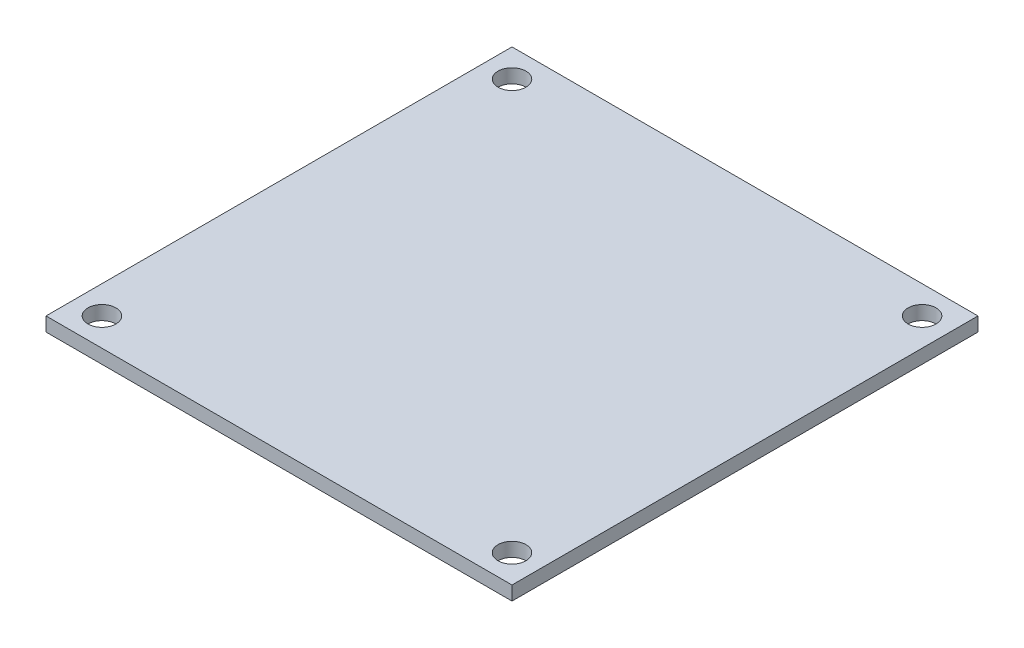
ISO-10303-21;
HEADER;
FILE_DESCRIPTION(('STEP AP214'),'2;1');
FILE_NAME('part.step','',(''),(''),'','','');
FILE_SCHEMA(('AUTOMOTIVE_DESIGN { 1 0 10303 214 1 1 1 1 }'));
ENDSEC;
DATA;
#1=APPLICATION_CONTEXT('core data for automotive mechanical design processes');
#2=APPLICATION_PROTOCOL_DEFINITION('international standard','automotive_design',2000,#1);
#3=PRODUCT_CONTEXT('',#1,'mechanical');
#4=PRODUCT('Part','Part','',(#3));
#5=PRODUCT_RELATED_PRODUCT_CATEGORY('part','',(#4));
#6=PRODUCT_DEFINITION_FORMATION('','',#4);
#7=PRODUCT_DEFINITION_CONTEXT('part definition',#1,'design');
#8=PRODUCT_DEFINITION('design','',#6,#7);
#9=PRODUCT_DEFINITION_SHAPE('','',#8);
#10=(LENGTH_UNIT() NAMED_UNIT(*) SI_UNIT(.MILLI.,.METRE.));
#11=(NAMED_UNIT(*) PLANE_ANGLE_UNIT() SI_UNIT($,.RADIAN.));
#12=(NAMED_UNIT(*) SI_UNIT($,.STERADIAN.) SOLID_ANGLE_UNIT());
#13=UNCERTAINTY_MEASURE_WITH_UNIT(LENGTH_MEASURE(1.E-05),#10,'distance_accuracy_value','');
#14=(GEOMETRIC_REPRESENTATION_CONTEXT(3) GLOBAL_UNCERTAINTY_ASSIGNED_CONTEXT((#13)) GLOBAL_UNIT_ASSIGNED_CONTEXT((#10,
#11,#12)) REPRESENTATION_CONTEXT('',''));
#15=CARTESIAN_POINT('',(0.,0.,0.));
#16=DIRECTION('',(0.,0.,1.));
#17=DIRECTION('',(1.,0.,0.));
#18=AXIS2_PLACEMENT_3D('',#15,#16,#17);
#19=CARTESIAN_POINT('',(0.,1.5,0.));
#20=DIRECTION('',(0.,-1.,0.));
#21=DIRECTION('',(0.,0.,-1.));
#22=AXIS2_PLACEMENT_3D('',#19,#20,#21);
#23=PLANE('',#22);
#24=DIRECTION('',(0.,0.,-1.));
#25=VECTOR('',#24,1.);
#26=CARTESIAN_POINT('',(25.,1.5,25.));
#27=LINE('',#26,#25);
#28=CARTESIAN_POINT('',(25.,1.5,25.));
#29=VERTEX_POINT('',#28);
#30=CARTESIAN_POINT('',(25.,1.5,-25.));
#31=VERTEX_POINT('',#30);
#32=EDGE_CURVE('E89',#29,#31,#27,.T.);
#33=ORIENTED_EDGE('',*,*,#32,.T.);
#34=DIRECTION('',(-1.,0.,0.));
#35=VECTOR('',#34,1.);
#36=CARTESIAN_POINT('',(-25.,1.5,-25.));
#37=LINE('',#36,#35);
#38=CARTESIAN_POINT('',(-25.,1.5,-25.));
#39=VERTEX_POINT('',#38);
#40=EDGE_CURVE('E84',#31,#39,#37,.T.);
#41=ORIENTED_EDGE('',*,*,#40,.T.);
#42=DIRECTION('',(0.,0.,1.));
#43=VECTOR('',#42,1.);
#44=CARTESIAN_POINT('',(-25.,1.5,25.));
#45=LINE('',#44,#43);
#46=CARTESIAN_POINT('',(-25.,1.5,25.));
#47=VERTEX_POINT('',#46);
#48=EDGE_CURVE('E87',#39,#47,#45,.T.);
#49=ORIENTED_EDGE('',*,*,#48,.T.);
#50=DIRECTION('',(1.,0.,0.));
#51=VECTOR('',#50,1.);
#52=CARTESIAN_POINT('',(-25.,1.5,25.));
#53=LINE('',#52,#51);
#54=EDGE_CURVE('E54',#47,#29,#53,.T.);
#55=ORIENTED_EDGE('',*,*,#54,.T.);
#56=EDGE_LOOP('',(#33,#41,#49,#55));
#57=FACE_BOUND('',#56,.T.);
#58=CARTESIAN_POINT('',(-22.,1.5,-22.));
#59=DIRECTION('',(0.,1.,0.));
#60=DIRECTION('',(0.,0.,1.));
#61=AXIS2_PLACEMENT_3D('',#58,#59,#60);
#62=CIRCLE('',#61,1.5);
#63=CARTESIAN_POINT('',(-22.,1.5,-20.5));
#64=VERTEX_POINT('',#63);
#65=EDGE_CURVE('E104',#64,#64,#62,.T.);
#66=ORIENTED_EDGE('',*,*,#65,.F.);
#67=EDGE_LOOP('',(#66));
#68=FACE_BOUND('',#67,.T.);
#69=CARTESIAN_POINT('',(22.,1.5,-22.));
#70=DIRECTION('',(0.,1.,0.));
#71=DIRECTION('',(0.,0.,1.));
#72=AXIS2_PLACEMENT_3D('',#69,#70,#71);
#73=CIRCLE('',#72,1.5);
#74=CARTESIAN_POINT('',(22.,1.5,-20.5));
#75=VERTEX_POINT('',#74);
#76=EDGE_CURVE('E119',#75,#75,#73,.T.);
#77=ORIENTED_EDGE('',*,*,#76,.F.);
#78=EDGE_LOOP('',(#77));
#79=FACE_BOUND('',#78,.T.);
#80=CARTESIAN_POINT('',(22.,1.5,22.));
#81=DIRECTION('',(0.,1.,0.));
#82=DIRECTION('',(0.,0.,-1.));
#83=AXIS2_PLACEMENT_3D('',#80,#81,#82);
#84=CIRCLE('',#83,1.5);
#85=CARTESIAN_POINT('',(22.,1.5,20.5));
#86=VERTEX_POINT('',#85);
#87=EDGE_CURVE('E125',#86,#86,#84,.T.);
#88=ORIENTED_EDGE('',*,*,#87,.F.);
#89=EDGE_LOOP('',(#88));
#90=FACE_BOUND('',#89,.T.);
#91=CARTESIAN_POINT('',(-22.,1.5,22.));
#92=DIRECTION('',(0.,1.,0.));
#93=DIRECTION('',(0.,0.,-1.));
#94=AXIS2_PLACEMENT_3D('',#91,#92,#93);
#95=CIRCLE('',#94,1.5);
#96=CARTESIAN_POINT('',(-22.,1.5,20.5));
#97=VERTEX_POINT('',#96);
#98=EDGE_CURVE('E131',#97,#97,#95,.T.);
#99=ORIENTED_EDGE('',*,*,#98,.F.);
#100=EDGE_LOOP('',(#99));
#101=FACE_BOUND('',#100,.T.);
#102=ADVANCED_FACE('F37',(#57,#68,#79,#90,#101),#23,.F.);
#103=CARTESIAN_POINT('',(0.,0.,0.));
#104=DIRECTION('',(0.,-1.,0.));
#105=DIRECTION('',(0.,0.,-1.));
#106=AXIS2_PLACEMENT_3D('',#103,#104,#105);
#107=PLANE('',#106);
#108=CARTESIAN_POINT('',(22.,0.,22.));
#109=DIRECTION('',(0.,1.,0.));
#110=DIRECTION('',(0.,0.,-1.));
#111=AXIS2_PLACEMENT_3D('',#108,#109,#110);
#112=CIRCLE('',#111,1.5);
#113=CARTESIAN_POINT('',(22.,0.,20.5));
#114=VERTEX_POINT('',#113);
#115=EDGE_CURVE('E128',#114,#114,#112,.T.);
#116=ORIENTED_EDGE('',*,*,#115,.T.);
#117=EDGE_LOOP('',(#116));
#118=FACE_BOUND('',#117,.T.);
#119=CARTESIAN_POINT('',(-22.,0.,-22.));
#120=DIRECTION('',(0.,1.,0.));
#121=DIRECTION('',(0.,0.,1.));
#122=AXIS2_PLACEMENT_3D('',#119,#120,#121);
#123=CIRCLE('',#122,1.5);
#124=CARTESIAN_POINT('',(-22.,0.,-20.5));
#125=VERTEX_POINT('',#124);
#126=EDGE_CURVE('E116',#125,#125,#123,.T.);
#127=ORIENTED_EDGE('',*,*,#126,.T.);
#128=EDGE_LOOP('',(#127));
#129=FACE_BOUND('',#128,.T.);
#130=DIRECTION('',(0.,0.,-1.));
#131=VECTOR('',#130,1.);
#132=CARTESIAN_POINT('',(25.,0.,25.));
#133=LINE('',#132,#131);
#134=CARTESIAN_POINT('',(25.,0.,25.));
#135=VERTEX_POINT('',#134);
#136=CARTESIAN_POINT('',(25.,0.,-25.));
#137=VERTEX_POINT('',#136);
#138=EDGE_CURVE('E101',#135,#137,#133,.T.);
#139=ORIENTED_EDGE('',*,*,#138,.F.);
#140=DIRECTION('',(1.,0.,0.));
#141=VECTOR('',#140,1.);
#142=CARTESIAN_POINT('',(-25.,0.,25.));
#143=LINE('',#142,#141);
#144=CARTESIAN_POINT('',(-25.,0.,25.));
#145=VERTEX_POINT('',#144);
#146=EDGE_CURVE('E77',#145,#135,#143,.T.);
#147=ORIENTED_EDGE('',*,*,#146,.F.);
#148=DIRECTION('',(0.,0.,1.));
#149=VECTOR('',#148,1.);
#150=CARTESIAN_POINT('',(-25.,0.,25.));
#151=LINE('',#150,#149);
#152=CARTESIAN_POINT('',(-25.,0.,-25.));
#153=VERTEX_POINT('',#152);
#154=EDGE_CURVE('E71',#153,#145,#151,.T.);
#155=ORIENTED_EDGE('',*,*,#154,.F.);
#156=DIRECTION('',(-1.,0.,0.));
#157=VECTOR('',#156,1.);
#158=CARTESIAN_POINT('',(-25.,0.,-25.));
#159=LINE('',#158,#157);
#160=EDGE_CURVE('E93',#137,#153,#159,.T.);
#161=ORIENTED_EDGE('',*,*,#160,.F.);
#162=EDGE_LOOP('',(#139,#147,#155,#161));
#163=FACE_BOUND('',#162,.T.);
#164=CARTESIAN_POINT('',(22.,0.,-22.));
#165=DIRECTION('',(0.,1.,0.));
#166=DIRECTION('',(0.,0.,1.));
#167=AXIS2_PLACEMENT_3D('',#164,#165,#166);
#168=CIRCLE('',#167,1.5);
#169=CARTESIAN_POINT('',(22.,0.,-20.5));
#170=VERTEX_POINT('',#169);
#171=EDGE_CURVE('E122',#170,#170,#168,.T.);
#172=ORIENTED_EDGE('',*,*,#171,.T.);
#173=EDGE_LOOP('',(#172));
#174=FACE_BOUND('',#173,.T.);
#175=CARTESIAN_POINT('',(-22.,0.,22.));
#176=DIRECTION('',(0.,1.,0.));
#177=DIRECTION('',(0.,0.,-1.));
#178=AXIS2_PLACEMENT_3D('',#175,#176,#177);
#179=CIRCLE('',#178,1.5);
#180=CARTESIAN_POINT('',(-22.,0.,20.5));
#181=VERTEX_POINT('',#180);
#182=EDGE_CURVE('E134',#181,#181,#179,.T.);
#183=ORIENTED_EDGE('',*,*,#182,.T.);
#184=EDGE_LOOP('',(#183));
#185=FACE_BOUND('',#184,.T.);
#186=ADVANCED_FACE('F112',(#118,#129,#163,#174,#185),#107,.T.);
#187=CARTESIAN_POINT('',(25.,1.5,25.));
#188=DIRECTION('',(-1.,0.,0.));
#189=DIRECTION('',(0.,0.,1.));
#190=AXIS2_PLACEMENT_3D('',#187,#188,#189);
#191=PLANE('',#190);
#192=ORIENTED_EDGE('',*,*,#138,.T.);
#193=DIRECTION('',(0.,-1.,0.));
#194=VECTOR('',#193,1.);
#195=CARTESIAN_POINT('',(25.,1.5,-25.));
#196=LINE('',#195,#194);
#197=EDGE_CURVE('E11',#31,#137,#196,.T.);
#198=ORIENTED_EDGE('',*,*,#197,.F.);
#199=ORIENTED_EDGE('',*,*,#32,.F.);
#200=DIRECTION('',(0.,-1.,0.));
#201=VECTOR('',#200,1.);
#202=CARTESIAN_POINT('',(25.,1.5,25.));
#203=LINE('',#202,#201);
#204=EDGE_CURVE('E97',#29,#135,#203,.T.);
#205=ORIENTED_EDGE('',*,*,#204,.T.);
#206=EDGE_LOOP('',(#192,#198,#199,#205));
#207=FACE_BOUND('',#206,.T.);
#208=ADVANCED_FACE('F39',(#207),#191,.F.);
#209=CARTESIAN_POINT('',(-25.,1.5,-25.));
#210=DIRECTION('',(0.,0.,1.));
#211=DIRECTION('',(1.,0.,0.));
#212=AXIS2_PLACEMENT_3D('',#209,#210,#211);
#213=PLANE('',#212);
#214=ORIENTED_EDGE('',*,*,#160,.T.);
#215=DIRECTION('',(0.,-1.,0.));
#216=VECTOR('',#215,1.);
#217=CARTESIAN_POINT('',(-25.,1.5,-25.));
#218=LINE('',#217,#216);
#219=EDGE_CURVE('E46',#39,#153,#218,.T.);
#220=ORIENTED_EDGE('',*,*,#219,.F.);
#221=ORIENTED_EDGE('',*,*,#40,.F.);
#222=ORIENTED_EDGE('',*,*,#197,.T.);
#223=EDGE_LOOP('',(#214,#220,#221,#222));
#224=FACE_BOUND('',#223,.T.);
#225=ADVANCED_FACE('F92',(#224),#213,.F.);
#226=CARTESIAN_POINT('',(-25.,1.5,25.));
#227=DIRECTION('',(1.,0.,0.));
#228=DIRECTION('',(0.,0.,-1.));
#229=AXIS2_PLACEMENT_3D('',#226,#227,#228);
#230=PLANE('',#229);
#231=ORIENTED_EDGE('',*,*,#154,.T.);
#232=DIRECTION('',(0.,-1.,0.));
#233=VECTOR('',#232,1.);
#234=CARTESIAN_POINT('',(-25.,1.5,25.));
#235=LINE('',#234,#233);
#236=EDGE_CURVE('E94',#47,#145,#235,.T.);
#237=ORIENTED_EDGE('',*,*,#236,.F.);
#238=ORIENTED_EDGE('',*,*,#48,.F.);
#239=ORIENTED_EDGE('',*,*,#219,.T.);
#240=EDGE_LOOP('',(#231,#237,#238,#239));
#241=FACE_BOUND('',#240,.T.);
#242=ADVANCED_FACE('F95',(#241),#230,.F.);
#243=CARTESIAN_POINT('',(-25.,1.5,25.));
#244=DIRECTION('',(0.,0.,-1.));
#245=DIRECTION('',(-1.,0.,0.));
#246=AXIS2_PLACEMENT_3D('',#243,#244,#245);
#247=PLANE('',#246);
#248=ORIENTED_EDGE('',*,*,#146,.T.);
#249=ORIENTED_EDGE('',*,*,#204,.F.);
#250=ORIENTED_EDGE('',*,*,#54,.F.);
#251=ORIENTED_EDGE('',*,*,#236,.T.);
#252=EDGE_LOOP('',(#248,#249,#250,#251));
#253=FACE_BOUND('',#252,.T.);
#254=ADVANCED_FACE('F109',(#253),#247,.F.);
#255=CARTESIAN_POINT('',(-22.,1.5,-22.));
#256=DIRECTION('',(0.,-1.,0.));
#257=DIRECTION('',(0.,0.,-1.));
#258=AXIS2_PLACEMENT_3D('',#255,#256,#257);
#259=CYLINDRICAL_SURFACE('',#258,1.5);
#260=ORIENTED_EDGE('',*,*,#65,.T.);
#261=EDGE_LOOP('',(#260));
#262=FACE_BOUND('',#261,.T.);
#263=ORIENTED_EDGE('',*,*,#126,.F.);
#264=EDGE_LOOP('',(#263));
#265=FACE_BOUND('',#264,.T.);
#266=ADVANCED_FACE('F151',(#262,#265),#259,.F.);
#267=CARTESIAN_POINT('',(22.,1.5,-22.));
#268=DIRECTION('',(0.,-1.,0.));
#269=DIRECTION('',(0.,0.,-1.));
#270=AXIS2_PLACEMENT_3D('',#267,#268,#269);
#271=CYLINDRICAL_SURFACE('',#270,1.5);
#272=ORIENTED_EDGE('',*,*,#76,.T.);
#273=EDGE_LOOP('',(#272));
#274=FACE_BOUND('',#273,.T.);
#275=ORIENTED_EDGE('',*,*,#171,.F.);
#276=EDGE_LOOP('',(#275));
#277=FACE_BOUND('',#276,.T.);
#278=ADVANCED_FACE('F197',(#274,#277),#271,.F.);
#279=CARTESIAN_POINT('',(22.,1.5,22.));
#280=DIRECTION('',(0.,-1.,0.));
#281=DIRECTION('',(0.,0.,-1.));
#282=AXIS2_PLACEMENT_3D('',#279,#280,#281);
#283=CYLINDRICAL_SURFACE('',#282,1.5);
#284=ORIENTED_EDGE('',*,*,#87,.T.);
#285=EDGE_LOOP('',(#284));
#286=FACE_BOUND('',#285,.T.);
#287=ORIENTED_EDGE('',*,*,#115,.F.);
#288=EDGE_LOOP('',(#287));
#289=FACE_BOUND('',#288,.T.);
#290=ADVANCED_FACE('F205',(#286,#289),#283,.F.);
#291=CARTESIAN_POINT('',(-22.,1.5,22.));
#292=DIRECTION('',(0.,-1.,0.));
#293=DIRECTION('',(0.,0.,-1.));
#294=AXIS2_PLACEMENT_3D('',#291,#292,#293);
#295=CYLINDRICAL_SURFACE('',#294,1.5);
#296=ORIENTED_EDGE('',*,*,#98,.T.);
#297=EDGE_LOOP('',(#296));
#298=FACE_BOUND('',#297,.T.);
#299=ORIENTED_EDGE('',*,*,#182,.F.);
#300=EDGE_LOOP('',(#299));
#301=FACE_BOUND('',#300,.T.);
#302=ADVANCED_FACE('F140',(#298,#301),#295,.F.);
#303=CLOSED_SHELL('',(#102,#186,#208,#225,#242,#254,#266,#278,#290,#302));
#304=MANIFOLD_SOLID_BREP('B2',#303);
#305=ADVANCED_BREP_SHAPE_REPRESENTATION('',(#18,#304),#14);
#306=SHAPE_DEFINITION_REPRESENTATION(#9,#305);
ENDSEC;
END-ISO-10303-21;
